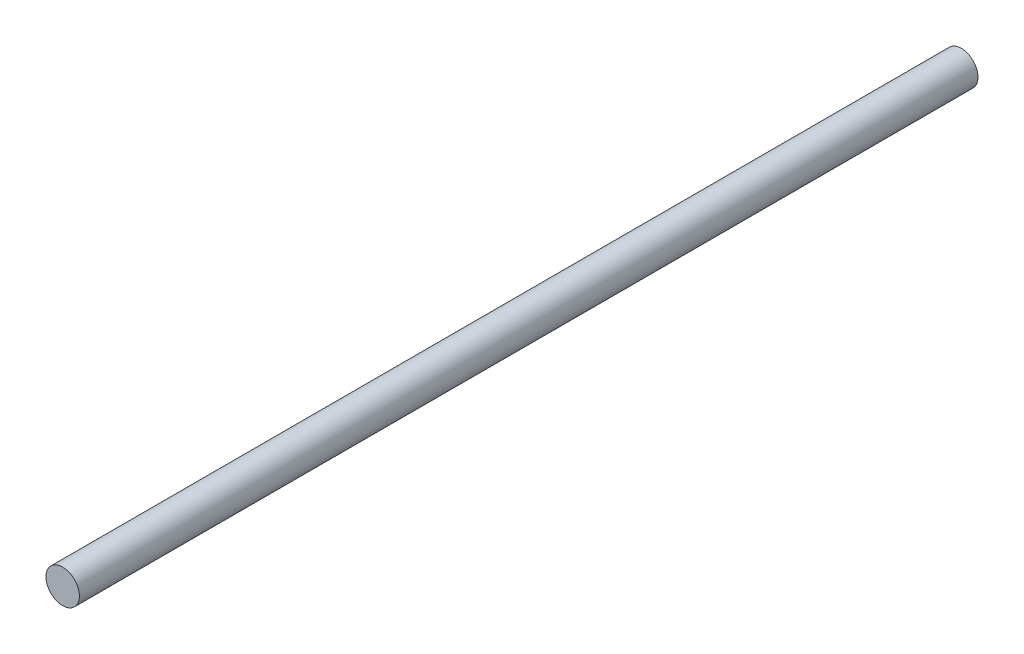
ISO-10303-21;
HEADER;
FILE_DESCRIPTION(('STEP AP214'),'2;1');
FILE_NAME('part.step','',(''),(''),'','','');
FILE_SCHEMA(('AUTOMOTIVE_DESIGN { 1 0 10303 214 1 1 1 1 }'));
ENDSEC;
DATA;
#1=APPLICATION_CONTEXT('core data for automotive mechanical design processes');
#2=APPLICATION_PROTOCOL_DEFINITION('international standard','automotive_design',2000,#1);
#3=PRODUCT_CONTEXT('',#1,'mechanical');
#4=PRODUCT('Part','Part','',(#3));
#5=PRODUCT_RELATED_PRODUCT_CATEGORY('part','',(#4));
#6=PRODUCT_DEFINITION_FORMATION('','',#4);
#7=PRODUCT_DEFINITION_CONTEXT('part definition',#1,'design');
#8=PRODUCT_DEFINITION('design','',#6,#7);
#9=PRODUCT_DEFINITION_SHAPE('','',#8);
#10=(LENGTH_UNIT() NAMED_UNIT(*) SI_UNIT(.MILLI.,.METRE.));
#11=(NAMED_UNIT(*) PLANE_ANGLE_UNIT() SI_UNIT($,.RADIAN.));
#12=(NAMED_UNIT(*) SI_UNIT($,.STERADIAN.) SOLID_ANGLE_UNIT());
#13=UNCERTAINTY_MEASURE_WITH_UNIT(LENGTH_MEASURE(1.E-05),#10,'distance_accuracy_value','');
#14=(GEOMETRIC_REPRESENTATION_CONTEXT(3) GLOBAL_UNCERTAINTY_ASSIGNED_CONTEXT((#13)) GLOBAL_UNIT_ASSIGNED_CONTEXT((#10,
#11,#12)) REPRESENTATION_CONTEXT('',''));
#15=CARTESIAN_POINT('',(0.,0.,0.));
#16=DIRECTION('',(0.,0.,1.));
#17=DIRECTION('',(1.,0.,0.));
#18=AXIS2_PLACEMENT_3D('',#15,#16,#17);
#19=CARTESIAN_POINT('',(0.,0.165675445819963,215.));
#20=DIRECTION('',(0.,0.,-1.));
#21=DIRECTION('',(-1.,0.,0.));
#22=AXIS2_PLACEMENT_3D('',#19,#20,#21);
#23=CYLINDRICAL_SURFACE('',#22,4.);
#24=CARTESIAN_POINT('',(0.,0.165675445819963,215.));
#25=DIRECTION('',(0.,0.,1.));
#26=DIRECTION('',(1.,0.,0.));
#27=AXIS2_PLACEMENT_3D('',#24,#25,#26);
#28=CIRCLE('',#27,4.);
#29=CARTESIAN_POINT('',(4.,0.165675445819963,215.));
#30=VERTEX_POINT('',#29);
#31=EDGE_CURVE('E10',#30,#30,#28,.T.);
#32=ORIENTED_EDGE('',*,*,#31,.F.);
#33=EDGE_LOOP('',(#32));
#34=FACE_BOUND('',#33,.T.);
#35=CARTESIAN_POINT('',(0.,0.165675445819963,0.));
#36=DIRECTION('',(0.,0.,1.));
#37=DIRECTION('',(1.,0.,0.));
#38=AXIS2_PLACEMENT_3D('',#35,#36,#37);
#39=CIRCLE('',#38,4.);
#40=CARTESIAN_POINT('',(4.,0.165675445819963,0.));
#41=VERTEX_POINT('',#40);
#42=EDGE_CURVE('E34',#41,#41,#39,.T.);
#43=ORIENTED_EDGE('',*,*,#42,.T.);
#44=EDGE_LOOP('',(#43));
#45=FACE_BOUND('',#44,.T.);
#46=ADVANCED_FACE('F31',(#34,#45),#23,.T.);
#47=CARTESIAN_POINT('',(0.,0.165675445819963,215.));
#48=DIRECTION('',(0.,0.,1.));
#49=DIRECTION('',(1.,0.,0.));
#50=AXIS2_PLACEMENT_3D('',#47,#48,#49);
#51=PLANE('',#50);
#52=ORIENTED_EDGE('',*,*,#31,.T.);
#53=EDGE_LOOP('',(#52));
#54=FACE_BOUND('',#53,.T.);
#55=ADVANCED_FACE('F46',(#54),#51,.T.);
#56=CARTESIAN_POINT('',(0.,0.165675445819963,0.));
#57=DIRECTION('',(0.,0.,1.));
#58=DIRECTION('',(1.,0.,0.));
#59=AXIS2_PLACEMENT_3D('',#56,#57,#58);
#60=PLANE('',#59);
#61=ORIENTED_EDGE('',*,*,#42,.F.);
#62=EDGE_LOOP('',(#61));
#63=FACE_BOUND('',#62,.T.);
#64=ADVANCED_FACE('F44',(#63),#60,.F.);
#65=CLOSED_SHELL('',(#46,#55,#64));
#66=MANIFOLD_SOLID_BREP('B2',#65);
#67=ADVANCED_BREP_SHAPE_REPRESENTATION('',(#18,#66),#14);
#68=SHAPE_DEFINITION_REPRESENTATION(#9,#67);
ENDSEC;
END-ISO-10303-21;
